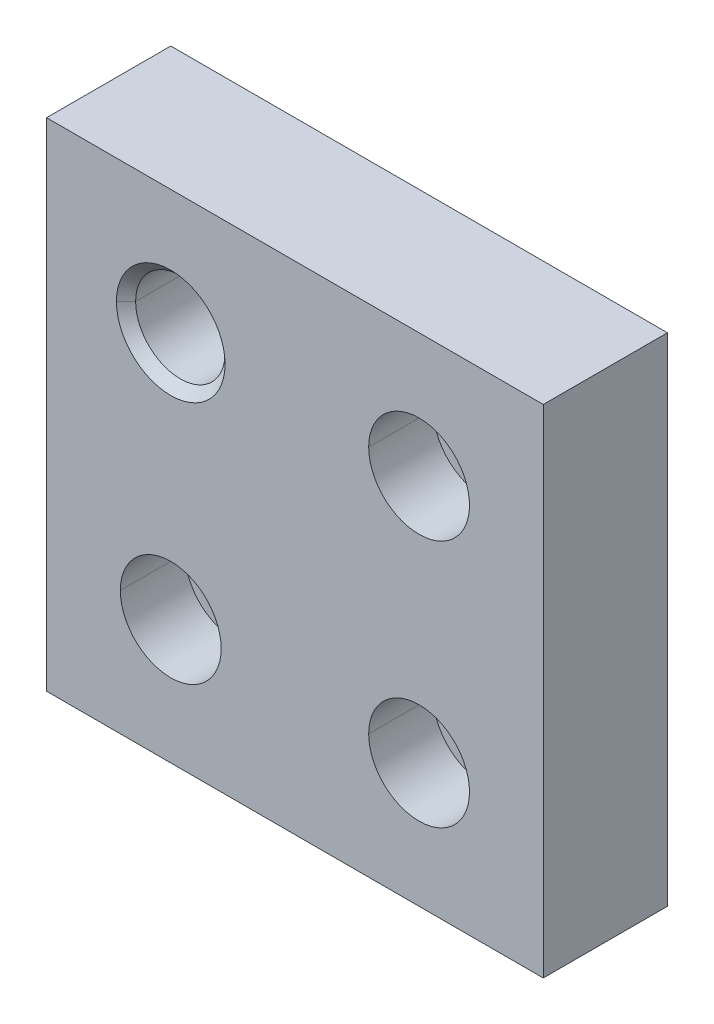
ISO-10303-21;
HEADER;
FILE_DESCRIPTION(('STEP AP214'),'2;1');
FILE_NAME('part.step','',(''),(''),'','','');
FILE_SCHEMA(('AUTOMOTIVE_DESIGN { 1 0 10303 214 1 1 1 1 }'));
ENDSEC;
DATA;
#1=APPLICATION_CONTEXT('core data for automotive mechanical design processes');
#2=APPLICATION_PROTOCOL_DEFINITION('international standard','automotive_design',2000,#1);
#3=PRODUCT_CONTEXT('',#1,'mechanical');
#4=PRODUCT('Part','Part','',(#3));
#5=PRODUCT_RELATED_PRODUCT_CATEGORY('part','',(#4));
#6=PRODUCT_DEFINITION_FORMATION('','',#4);
#7=PRODUCT_DEFINITION_CONTEXT('part definition',#1,'design');
#8=PRODUCT_DEFINITION('design','',#6,#7);
#9=PRODUCT_DEFINITION_SHAPE('','',#8);
#10=(LENGTH_UNIT() NAMED_UNIT(*) SI_UNIT(.MILLI.,.METRE.));
#11=(NAMED_UNIT(*) PLANE_ANGLE_UNIT() SI_UNIT($,.RADIAN.));
#12=(NAMED_UNIT(*) SI_UNIT($,.STERADIAN.) SOLID_ANGLE_UNIT());
#13=UNCERTAINTY_MEASURE_WITH_UNIT(LENGTH_MEASURE(1.E-05),#10,'distance_accuracy_value','');
#14=(GEOMETRIC_REPRESENTATION_CONTEXT(3) GLOBAL_UNCERTAINTY_ASSIGNED_CONTEXT((#13)) GLOBAL_UNIT_ASSIGNED_CONTEXT((#10,
#11,#12)) REPRESENTATION_CONTEXT('',''));
#15=CARTESIAN_POINT('',(0.,0.,0.));
#16=DIRECTION('',(0.,0.,1.));
#17=DIRECTION('',(1.,0.,0.));
#18=AXIS2_PLACEMENT_3D('',#15,#16,#17);
#19=CARTESIAN_POINT('',(25.4,-25.4,0.));
#20=DIRECTION('',(1.,0.,0.));
#21=DIRECTION('',(0.,0.,-1.));
#22=AXIS2_PLACEMENT_3D('',#19,#20,#21);
#23=PLANE('',#22);
#24=DIRECTION('',(0.,1.,0.));
#25=VECTOR('',#24,1.);
#26=CARTESIAN_POINT('',(25.4,-25.4,12.7));
#27=LINE('',#26,#25);
#28=CARTESIAN_POINT('',(25.4,-25.4,12.7));
#29=VERTEX_POINT('',#28);
#30=CARTESIAN_POINT('',(25.4,25.4,12.7));
#31=VERTEX_POINT('',#30);
#32=EDGE_CURVE('E11',#29,#31,#27,.T.);
#33=ORIENTED_EDGE('',*,*,#32,.F.);
#34=DIRECTION('',(0.,0.,1.));
#35=VECTOR('',#34,1.);
#36=CARTESIAN_POINT('',(25.4,-25.4,0.));
#37=LINE('',#36,#35);
#38=CARTESIAN_POINT('',(25.4,-25.4,0.));
#39=VERTEX_POINT('',#38);
#40=EDGE_CURVE('E25',#39,#29,#37,.T.);
#41=ORIENTED_EDGE('',*,*,#40,.F.);
#42=DIRECTION('',(0.,1.,0.));
#43=VECTOR('',#42,1.);
#44=CARTESIAN_POINT('',(25.4,-25.4,0.));
#45=LINE('',#44,#43);
#46=CARTESIAN_POINT('',(25.4,25.4,0.));
#47=VERTEX_POINT('',#46);
#48=EDGE_CURVE('E432',#39,#47,#45,.T.);
#49=ORIENTED_EDGE('',*,*,#48,.T.);
#50=DIRECTION('',(0.,0.,1.));
#51=VECTOR('',#50,1.);
#52=CARTESIAN_POINT('',(25.4,25.4,0.));
#53=LINE('',#52,#51);
#54=EDGE_CURVE('E428',#47,#31,#53,.T.);
#55=ORIENTED_EDGE('',*,*,#54,.T.);
#56=EDGE_LOOP('',(#33,#41,#49,#55));
#57=FACE_BOUND('',#56,.T.);
#58=ADVANCED_FACE('F17',(#57),#23,.T.);
#59=CARTESIAN_POINT('',(25.4,25.4,0.));
#60=DIRECTION('',(0.,1.,0.));
#61=DIRECTION('',(0.,0.,1.));
#62=AXIS2_PLACEMENT_3D('',#59,#60,#61);
#63=PLANE('',#62);
#64=DIRECTION('',(-1.,0.,0.));
#65=VECTOR('',#64,1.);
#66=CARTESIAN_POINT('',(25.4,25.4,12.7));
#67=LINE('',#66,#65);
#68=CARTESIAN_POINT('',(-25.4,25.4,12.7));
#69=VERTEX_POINT('',#68);
#70=EDGE_CURVE('E423',#31,#69,#67,.T.);
#71=ORIENTED_EDGE('',*,*,#70,.F.);
#72=ORIENTED_EDGE('',*,*,#54,.F.);
#73=DIRECTION('',(-1.,0.,0.));
#74=VECTOR('',#73,1.);
#75=CARTESIAN_POINT('',(25.4,25.4,0.));
#76=LINE('',#75,#74);
#77=CARTESIAN_POINT('',(-25.4,25.4,0.));
#78=VERTEX_POINT('',#77);
#79=EDGE_CURVE('E419',#47,#78,#76,.T.);
#80=ORIENTED_EDGE('',*,*,#79,.T.);
#81=DIRECTION('',(0.,0.,1.));
#82=VECTOR('',#81,1.);
#83=CARTESIAN_POINT('',(-25.4,25.4,0.));
#84=LINE('',#83,#82);
#85=EDGE_CURVE('E415',#78,#69,#84,.T.);
#86=ORIENTED_EDGE('',*,*,#85,.T.);
#87=EDGE_LOOP('',(#71,#72,#80,#86));
#88=FACE_BOUND('',#87,.T.);
#89=ADVANCED_FACE('F453',(#88),#63,.T.);
#90=CARTESIAN_POINT('',(-25.4,25.4,0.));
#91=DIRECTION('',(-1.,0.,0.));
#92=DIRECTION('',(0.,0.,1.));
#93=AXIS2_PLACEMENT_3D('',#90,#91,#92);
#94=PLANE('',#93);
#95=DIRECTION('',(0.,-1.,0.));
#96=VECTOR('',#95,1.);
#97=CARTESIAN_POINT('',(-25.4,25.4,12.7));
#98=LINE('',#97,#96);
#99=CARTESIAN_POINT('',(-25.4,-25.4,12.7));
#100=VERTEX_POINT('',#99);
#101=EDGE_CURVE('E410',#69,#100,#98,.T.);
#102=ORIENTED_EDGE('',*,*,#101,.F.);
#103=ORIENTED_EDGE('',*,*,#85,.F.);
#104=DIRECTION('',(0.,-1.,0.));
#105=VECTOR('',#104,1.);
#106=CARTESIAN_POINT('',(-25.4,25.4,0.));
#107=LINE('',#106,#105);
#108=CARTESIAN_POINT('',(-25.4,-25.4,0.));
#109=VERTEX_POINT('',#108);
#110=EDGE_CURVE('E406',#78,#109,#107,.T.);
#111=ORIENTED_EDGE('',*,*,#110,.T.);
#112=DIRECTION('',(0.,0.,1.));
#113=VECTOR('',#112,1.);
#114=CARTESIAN_POINT('',(-25.4,-25.4,0.));
#115=LINE('',#114,#113);
#116=EDGE_CURVE('E402',#109,#100,#115,.T.);
#117=ORIENTED_EDGE('',*,*,#116,.T.);
#118=EDGE_LOOP('',(#102,#103,#111,#117));
#119=FACE_BOUND('',#118,.T.);
#120=ADVANCED_FACE('F459',(#119),#94,.T.);
#121=CARTESIAN_POINT('',(-25.4,-25.4,0.));
#122=DIRECTION('',(0.,-1.,0.));
#123=DIRECTION('',(1.,0.,0.));
#124=AXIS2_PLACEMENT_3D('',#121,#122,#123);
#125=PLANE('',#124);
#126=DIRECTION('',(1.,0.,0.));
#127=VECTOR('',#126,1.);
#128=CARTESIAN_POINT('',(-25.4,-25.4,12.7));
#129=LINE('',#128,#127);
#130=EDGE_CURVE('E398',#100,#29,#129,.T.);
#131=ORIENTED_EDGE('',*,*,#130,.F.);
#132=ORIENTED_EDGE('',*,*,#116,.F.);
#133=DIRECTION('',(1.,0.,0.));
#134=VECTOR('',#133,1.);
#135=CARTESIAN_POINT('',(-25.4,-25.4,0.));
#136=LINE('',#135,#134);
#137=EDGE_CURVE('E394',#109,#39,#136,.T.);
#138=ORIENTED_EDGE('',*,*,#137,.T.);
#139=ORIENTED_EDGE('',*,*,#40,.T.);
#140=EDGE_LOOP('',(#131,#132,#138,#139));
#141=FACE_BOUND('',#140,.T.);
#142=ADVANCED_FACE('F442',(#141),#125,.T.);
#143=CARTESIAN_POINT('',(0.,0.,0.));
#144=DIRECTION('',(0.,0.,1.));
#145=DIRECTION('',(1.,0.,0.));
#146=AXIS2_PLACEMENT_3D('',#143,#144,#145);
#147=PLANE('',#146);
#148=CARTESIAN_POINT('',(-12.7,-12.7,0.));
#149=DIRECTION('',(0.,0.,1.));
#150=DIRECTION('',(1.,0.,0.));
#151=AXIS2_PLACEMENT_3D('',#148,#149,#150);
#152=CIRCLE('',#151,3.2639);
#153=CARTESIAN_POINT('',(-9.4361,-12.7,0.));
#154=VERTEX_POINT('',#153);
#155=CARTESIAN_POINT('',(-15.9639,-12.7,0.));
#156=VERTEX_POINT('',#155);
#157=EDGE_CURVE('E163',#154,#156,#152,.T.);
#158=ORIENTED_EDGE('',*,*,#157,.T.);
#159=CARTESIAN_POINT('',(-12.7,-12.7,0.));
#160=DIRECTION('',(0.,0.,1.));
#161=DIRECTION('',(1.,0.,0.));
#162=AXIS2_PLACEMENT_3D('',#159,#160,#161);
#163=CIRCLE('',#162,3.2639);
#164=EDGE_CURVE('E387',#156,#154,#163,.T.);
#165=ORIENTED_EDGE('',*,*,#164,.T.);
#166=EDGE_LOOP('',(#158,#165));
#167=FACE_BOUND('',#166,.T.);
#168=CARTESIAN_POINT('',(12.7,-12.7,0.));
#169=DIRECTION('',(0.,0.,1.));
#170=DIRECTION('',(1.,0.,0.));
#171=AXIS2_PLACEMENT_3D('',#168,#169,#170);
#172=CIRCLE('',#171,3.2639);
#173=CARTESIAN_POINT('',(15.9639,-12.7,0.));
#174=VERTEX_POINT('',#173);
#175=CARTESIAN_POINT('',(9.4361,-12.7,0.));
#176=VERTEX_POINT('',#175);
#177=EDGE_CURVE('E383',#174,#176,#172,.T.);
#178=ORIENTED_EDGE('',*,*,#177,.T.);
#179=CARTESIAN_POINT('',(12.7,-12.7,0.));
#180=DIRECTION('',(0.,0.,1.));
#181=DIRECTION('',(1.,0.,0.));
#182=AXIS2_PLACEMENT_3D('',#179,#180,#181);
#183=CIRCLE('',#182,3.2639);
#184=EDGE_CURVE('E379',#176,#174,#183,.T.);
#185=ORIENTED_EDGE('',*,*,#184,.T.);
#186=EDGE_LOOP('',(#178,#185));
#187=FACE_BOUND('',#186,.T.);
#188=CARTESIAN_POINT('',(12.7,12.7,0.));
#189=DIRECTION('',(0.,0.,1.));
#190=DIRECTION('',(1.,0.,0.));
#191=AXIS2_PLACEMENT_3D('',#188,#189,#190);
#192=CIRCLE('',#191,3.2639);
#193=CARTESIAN_POINT('',(15.9639,12.7,0.));
#194=VERTEX_POINT('',#193);
#195=CARTESIAN_POINT('',(9.4361,12.7,0.));
#196=VERTEX_POINT('',#195);
#197=EDGE_CURVE('E375',#194,#196,#192,.T.);
#198=ORIENTED_EDGE('',*,*,#197,.T.);
#199=CARTESIAN_POINT('',(12.7,12.7,0.));
#200=DIRECTION('',(0.,0.,1.));
#201=DIRECTION('',(1.,0.,0.));
#202=AXIS2_PLACEMENT_3D('',#199,#200,#201);
#203=CIRCLE('',#202,3.2639);
#204=EDGE_CURVE('E371',#196,#194,#203,.T.);
#205=ORIENTED_EDGE('',*,*,#204,.T.);
#206=EDGE_LOOP('',(#198,#205));
#207=FACE_BOUND('',#206,.T.);
#208=CARTESIAN_POINT('',(-12.7,12.7,0.));
#209=DIRECTION('',(0.,0.,-1.));
#210=DIRECTION('',(-1.,0.,0.));
#211=AXIS2_PLACEMENT_3D('',#208,#209,#210);
#212=CIRCLE('',#211,5.55625);
#213=CARTESIAN_POINT('',(-7.14375,12.7,0.));
#214=VERTEX_POINT('',#213);
#215=CARTESIAN_POINT('',(-18.25625,12.7,0.));
#216=VERTEX_POINT('',#215);
#217=EDGE_CURVE('E366',#214,#216,#212,.T.);
#218=ORIENTED_EDGE('',*,*,#217,.F.);
#219=CARTESIAN_POINT('',(-12.7,12.7,0.));
#220=DIRECTION('',(0.,0.,-1.));
#221=DIRECTION('',(-1.,0.,0.));
#222=AXIS2_PLACEMENT_3D('',#219,#220,#221);
#223=CIRCLE('',#222,5.55625);
#224=EDGE_CURVE('E361',#216,#214,#223,.T.);
#225=ORIENTED_EDGE('',*,*,#224,.F.);
#226=EDGE_LOOP('',(#218,#225));
#227=FACE_BOUND('',#226,.T.);
#228=ORIENTED_EDGE('',*,*,#48,.F.);
#229=ORIENTED_EDGE('',*,*,#137,.F.);
#230=ORIENTED_EDGE('',*,*,#110,.F.);
#231=ORIENTED_EDGE('',*,*,#79,.F.);
#232=EDGE_LOOP('',(#228,#229,#230,#231));
#233=FACE_BOUND('',#232,.T.);
#234=ADVANCED_FACE('F449',(#167,#187,#207,#227,#233),#147,.F.);
#235=CARTESIAN_POINT('',(-12.7,12.7,0.98171));
#236=DIRECTION('',(0.,0.,-1.));
#237=DIRECTION('',(0.,-1.,0.));
#238=AXIS2_PLACEMENT_3D('',#235,#236,#237);
#239=CONICAL_SURFACE('',#238,4.57454,0.785398163397446);
#240=DIRECTION('',(0.707106781186546,0.,-0.707106781186549));
#241=VECTOR('',#240,1.);
#242=CARTESIAN_POINT('',(-8.12546,12.7,0.981710000000001));
#243=LINE('',#242,#241);
#244=CARTESIAN_POINT('',(-8.12546,12.7,0.98171));
#245=VERTEX_POINT('',#244);
#246=EDGE_CURVE('E356',#245,#214,#243,.T.);
#247=ORIENTED_EDGE('',*,*,#246,.F.);
#248=CARTESIAN_POINT('',(-12.7,12.7,0.98171));
#249=DIRECTION('',(0.,0.,-1.));
#250=DIRECTION('',(-1.,0.,0.));
#251=AXIS2_PLACEMENT_3D('',#248,#249,#250);
#252=CIRCLE('',#251,4.57454);
#253=CARTESIAN_POINT('',(-17.27454,12.7,0.98171));
#254=VERTEX_POINT('',#253);
#255=EDGE_CURVE('E351',#254,#245,#252,.T.);
#256=ORIENTED_EDGE('',*,*,#255,.F.);
#257=DIRECTION('',(-0.707106781186546,0.,-0.707106781186549));
#258=VECTOR('',#257,1.);
#259=CARTESIAN_POINT('',(-17.27454,12.7,0.981710000000001));
#260=LINE('',#259,#258);
#261=EDGE_CURVE('E346',#254,#216,#260,.T.);
#262=ORIENTED_EDGE('',*,*,#261,.T.);
#263=ORIENTED_EDGE('',*,*,#224,.T.);
#264=EDGE_LOOP('',(#247,#256,#262,#263));
#265=FACE_BOUND('',#264,.T.);
#266=ADVANCED_FACE('F502',(#265),#239,.F.);
#267=CARTESIAN_POINT('',(-12.7,12.7,0.98171));
#268=DIRECTION('',(0.,0.,-1.));
#269=DIRECTION('',(0.,1.,0.));
#270=AXIS2_PLACEMENT_3D('',#267,#268,#269);
#271=CONICAL_SURFACE('',#270,4.57454,0.785398163397446);
#272=ORIENTED_EDGE('',*,*,#246,.T.);
#273=ORIENTED_EDGE('',*,*,#217,.T.);
#274=ORIENTED_EDGE('',*,*,#261,.F.);
#275=CARTESIAN_POINT('',(-12.7,12.7,0.98171));
#276=DIRECTION('',(0.,0.,-1.));
#277=DIRECTION('',(-1.,0.,0.));
#278=AXIS2_PLACEMENT_3D('',#275,#276,#277);
#279=CIRCLE('',#278,4.57454);
#280=EDGE_CURVE('E341',#245,#254,#279,.T.);
#281=ORIENTED_EDGE('',*,*,#280,.F.);
#282=EDGE_LOOP('',(#272,#273,#274,#281));
#283=FACE_BOUND('',#282,.T.);
#284=ADVANCED_FACE('F513',(#283),#271,.F.);
#285=CARTESIAN_POINT('',(-12.7,12.7,0.));
#286=DIRECTION('',(0.,0.,-1.));
#287=DIRECTION('',(0.,1.,0.));
#288=AXIS2_PLACEMENT_3D('',#285,#286,#287);
#289=CYLINDRICAL_SURFACE('',#288,4.57454);
#290=DIRECTION('',(0.,0.,-1.));
#291=VECTOR('',#290,1.);
#292=CARTESIAN_POINT('',(-8.12546,12.7,11.71829));
#293=LINE('',#292,#291);
#294=CARTESIAN_POINT('',(-8.12546,12.7,11.71829));
#295=VERTEX_POINT('',#294);
#296=EDGE_CURVE('E336',#295,#245,#293,.T.);
#297=ORIENTED_EDGE('',*,*,#296,.T.);
#298=ORIENTED_EDGE('',*,*,#280,.T.);
#299=DIRECTION('',(0.,0.,-1.));
#300=VECTOR('',#299,1.);
#301=CARTESIAN_POINT('',(-17.27454,12.7,11.71829));
#302=LINE('',#301,#300);
#303=CARTESIAN_POINT('',(-17.27454,12.7,11.71829));
#304=VERTEX_POINT('',#303);
#305=EDGE_CURVE('E331',#304,#254,#302,.T.);
#306=ORIENTED_EDGE('',*,*,#305,.F.);
#307=CARTESIAN_POINT('',(-12.7,12.7,11.71829));
#308=DIRECTION('',(0.,0.,-1.));
#309=DIRECTION('',(-1.,0.,0.));
#310=AXIS2_PLACEMENT_3D('',#307,#308,#309);
#311=CIRCLE('',#310,4.57454);
#312=EDGE_CURVE('E326',#295,#304,#311,.T.);
#313=ORIENTED_EDGE('',*,*,#312,.F.);
#314=EDGE_LOOP('',(#297,#298,#306,#313));
#315=FACE_BOUND('',#314,.T.);
#316=ADVANCED_FACE('F524',(#315),#289,.F.);
#317=CARTESIAN_POINT('',(-12.7,12.7,12.7));
#318=DIRECTION('',(0.,0.,1.));
#319=DIRECTION('',(0.,1.,0.));
#320=AXIS2_PLACEMENT_3D('',#317,#318,#319);
#321=CONICAL_SURFACE('',#320,5.55625,0.785398163397446);
#322=DIRECTION('',(-0.707106781186546,0.,0.707106781186549));
#323=VECTOR('',#322,1.);
#324=CARTESIAN_POINT('',(-17.27454,12.7,11.71829));
#325=LINE('',#324,#323);
#326=CARTESIAN_POINT('',(-18.25625,12.7,12.7));
#327=VERTEX_POINT('',#326);
#328=EDGE_CURVE('E322',#304,#327,#325,.T.);
#329=ORIENTED_EDGE('',*,*,#328,.T.);
#330=CARTESIAN_POINT('',(-12.7,12.7,12.7));
#331=DIRECTION('',(0.,0.,-1.));
#332=DIRECTION('',(-1.,0.,0.));
#333=AXIS2_PLACEMENT_3D('',#330,#331,#332);
#334=CIRCLE('',#333,5.55625);
#335=CARTESIAN_POINT('',(-7.14375,12.7,12.7));
#336=VERTEX_POINT('',#335);
#337=EDGE_CURVE('E317',#336,#327,#334,.T.);
#338=ORIENTED_EDGE('',*,*,#337,.F.);
#339=DIRECTION('',(0.707106781186545,0.,0.70710678118655));
#340=VECTOR('',#339,1.);
#341=CARTESIAN_POINT('',(-8.12546,12.7,11.71829));
#342=LINE('',#341,#340);
#343=EDGE_CURVE('E312',#295,#336,#342,.T.);
#344=ORIENTED_EDGE('',*,*,#343,.F.);
#345=ORIENTED_EDGE('',*,*,#312,.T.);
#346=EDGE_LOOP('',(#329,#338,#344,#345));
#347=FACE_BOUND('',#346,.T.);
#348=ADVANCED_FACE('F535',(#347),#321,.F.);
#349=CARTESIAN_POINT('',(-12.7,12.7,12.7));
#350=DIRECTION('',(0.,0.,1.));
#351=DIRECTION('',(0.,-1.,0.));
#352=AXIS2_PLACEMENT_3D('',#349,#350,#351);
#353=CONICAL_SURFACE('',#352,5.55625,0.785398163397446);
#354=ORIENTED_EDGE('',*,*,#328,.F.);
#355=CARTESIAN_POINT('',(-12.7,12.7,11.71829));
#356=DIRECTION('',(0.,0.,-1.));
#357=DIRECTION('',(-1.,0.,0.));
#358=AXIS2_PLACEMENT_3D('',#355,#356,#357);
#359=CIRCLE('',#358,4.57454);
#360=EDGE_CURVE('E307',#304,#295,#359,.T.);
#361=ORIENTED_EDGE('',*,*,#360,.T.);
#362=ORIENTED_EDGE('',*,*,#343,.T.);
#363=CARTESIAN_POINT('',(-12.7,12.7,12.7));
#364=DIRECTION('',(0.,0.,-1.));
#365=DIRECTION('',(-1.,0.,0.));
#366=AXIS2_PLACEMENT_3D('',#363,#364,#365);
#367=CIRCLE('',#366,5.55625);
#368=EDGE_CURVE('E302',#327,#336,#367,.T.);
#369=ORIENTED_EDGE('',*,*,#368,.F.);
#370=EDGE_LOOP('',(#354,#361,#362,#369));
#371=FACE_BOUND('',#370,.T.);
#372=ADVANCED_FACE('F546',(#371),#353,.F.);
#373=CARTESIAN_POINT('',(0.,0.,12.7));
#374=DIRECTION('',(0.,0.,1.));
#375=DIRECTION('',(1.,0.,0.));
#376=AXIS2_PLACEMENT_3D('',#373,#374,#375);
#377=PLANE('',#376);
#378=CARTESIAN_POINT('',(-12.7,-12.7,12.7));
#379=DIRECTION('',(0.,0.,1.));
#380=DIRECTION('',(1.,0.,0.));
#381=AXIS2_PLACEMENT_3D('',#378,#379,#380);
#382=CIRCLE('',#381,5.1562);
#383=CARTESIAN_POINT('',(-17.8562,-12.7,12.7));
#384=VERTEX_POINT('',#383);
#385=CARTESIAN_POINT('',(-7.5438,-12.7,12.7));
#386=VERTEX_POINT('',#385);
#387=EDGE_CURVE('E297',#384,#386,#382,.T.);
#388=ORIENTED_EDGE('',*,*,#387,.F.);
#389=CARTESIAN_POINT('',(-12.7,-12.7,12.7));
#390=DIRECTION('',(0.,0.,1.));
#391=DIRECTION('',(1.,0.,0.));
#392=AXIS2_PLACEMENT_3D('',#389,#390,#391);
#393=CIRCLE('',#392,5.1562);
#394=EDGE_CURVE('E292',#386,#384,#393,.T.);
#395=ORIENTED_EDGE('',*,*,#394,.F.);
#396=EDGE_LOOP('',(#388,#395));
#397=FACE_BOUND('',#396,.T.);
#398=CARTESIAN_POINT('',(12.7,-12.7,12.7));
#399=DIRECTION('',(0.,0.,1.));
#400=DIRECTION('',(1.,0.,0.));
#401=AXIS2_PLACEMENT_3D('',#398,#399,#400);
#402=CIRCLE('',#401,5.1562);
#403=CARTESIAN_POINT('',(7.5438,-12.7,12.7));
#404=VERTEX_POINT('',#403);
#405=CARTESIAN_POINT('',(17.8562,-12.7,12.7));
#406=VERTEX_POINT('',#405);
#407=EDGE_CURVE('E287',#404,#406,#402,.T.);
#408=ORIENTED_EDGE('',*,*,#407,.F.);
#409=CARTESIAN_POINT('',(12.7,-12.7,12.7));
#410=DIRECTION('',(0.,0.,1.));
#411=DIRECTION('',(1.,0.,0.));
#412=AXIS2_PLACEMENT_3D('',#409,#410,#411);
#413=CIRCLE('',#412,5.1562);
#414=EDGE_CURVE('E282',#406,#404,#413,.T.);
#415=ORIENTED_EDGE('',*,*,#414,.F.);
#416=EDGE_LOOP('',(#408,#415));
#417=FACE_BOUND('',#416,.T.);
#418=CARTESIAN_POINT('',(12.7,12.7,12.7));
#419=DIRECTION('',(0.,0.,1.));
#420=DIRECTION('',(1.,0.,0.));
#421=AXIS2_PLACEMENT_3D('',#418,#419,#420);
#422=CIRCLE('',#421,5.1562);
#423=CARTESIAN_POINT('',(7.5438,12.7,12.7));
#424=VERTEX_POINT('',#423);
#425=CARTESIAN_POINT('',(17.8562,12.7,12.7));
#426=VERTEX_POINT('',#425);
#427=EDGE_CURVE('E277',#424,#426,#422,.T.);
#428=ORIENTED_EDGE('',*,*,#427,.F.);
#429=CARTESIAN_POINT('',(12.7,12.7,12.7));
#430=DIRECTION('',(0.,0.,1.));
#431=DIRECTION('',(1.,0.,0.));
#432=AXIS2_PLACEMENT_3D('',#429,#430,#431);
#433=CIRCLE('',#432,5.1562);
#434=EDGE_CURVE('E272',#426,#424,#433,.T.);
#435=ORIENTED_EDGE('',*,*,#434,.F.);
#436=EDGE_LOOP('',(#428,#435));
#437=FACE_BOUND('',#436,.T.);
#438=ORIENTED_EDGE('',*,*,#368,.T.);
#439=ORIENTED_EDGE('',*,*,#337,.T.);
#440=EDGE_LOOP('',(#438,#439));
#441=FACE_BOUND('',#440,.T.);
#442=ORIENTED_EDGE('',*,*,#32,.T.);
#443=ORIENTED_EDGE('',*,*,#70,.T.);
#444=ORIENTED_EDGE('',*,*,#101,.T.);
#445=ORIENTED_EDGE('',*,*,#130,.T.);
#446=EDGE_LOOP('',(#442,#443,#444,#445));
#447=FACE_BOUND('',#446,.T.);
#448=ADVANCED_FACE('F457',(#397,#417,#437,#441,#447),#377,.T.);
#449=CARTESIAN_POINT('',(12.7,12.7,12.7));
#450=DIRECTION('',(0.,0.,1.));
#451=DIRECTION('',(0.,-1.,0.));
#452=AXIS2_PLACEMENT_3D('',#449,#450,#451);
#453=CYLINDRICAL_SURFACE('',#452,5.1562);
#454=DIRECTION('',(0.,0.,1.));
#455=VECTOR('',#454,1.);
#456=CARTESIAN_POINT('',(7.5438,12.7,6.096));
#457=LINE('',#456,#455);
#458=CARTESIAN_POINT('',(7.5438,12.7,6.096));
#459=VERTEX_POINT('',#458);
#460=EDGE_CURVE('E267',#459,#424,#457,.T.);
#461=ORIENTED_EDGE('',*,*,#460,.F.);
#462=CARTESIAN_POINT('',(12.7,12.7,6.096));
#463=DIRECTION('',(0.,0.,1.));
#464=DIRECTION('',(1.,0.,0.));
#465=AXIS2_PLACEMENT_3D('',#462,#463,#464);
#466=CIRCLE('',#465,5.1562);
#467=CARTESIAN_POINT('',(17.8562,12.7,6.096));
#468=VERTEX_POINT('',#467);
#469=EDGE_CURVE('E262',#468,#459,#466,.T.);
#470=ORIENTED_EDGE('',*,*,#469,.F.);
#471=DIRECTION('',(0.,0.,1.));
#472=VECTOR('',#471,1.);
#473=CARTESIAN_POINT('',(17.8562,12.7,6.096));
#474=LINE('',#473,#472);
#475=EDGE_CURVE('E257',#468,#426,#474,.T.);
#476=ORIENTED_EDGE('',*,*,#475,.T.);
#477=ORIENTED_EDGE('',*,*,#434,.T.);
#478=EDGE_LOOP('',(#461,#470,#476,#477));
#479=FACE_BOUND('',#478,.T.);
#480=ADVANCED_FACE('F567',(#479),#453,.F.);
#481=CARTESIAN_POINT('',(12.7,12.7,12.7));
#482=DIRECTION('',(0.,0.,1.));
#483=DIRECTION('',(0.,1.,0.));
#484=AXIS2_PLACEMENT_3D('',#481,#482,#483);
#485=CYLINDRICAL_SURFACE('',#484,5.1562);
#486=ORIENTED_EDGE('',*,*,#460,.T.);
#487=ORIENTED_EDGE('',*,*,#427,.T.);
#488=ORIENTED_EDGE('',*,*,#475,.F.);
#489=CARTESIAN_POINT('',(12.7,12.7,6.096));
#490=DIRECTION('',(0.,0.,1.));
#491=DIRECTION('',(1.,0.,0.));
#492=AXIS2_PLACEMENT_3D('',#489,#490,#491);
#493=CIRCLE('',#492,5.1562);
#494=EDGE_CURVE('E252',#459,#468,#493,.T.);
#495=ORIENTED_EDGE('',*,*,#494,.F.);
#496=EDGE_LOOP('',(#486,#487,#488,#495));
#497=FACE_BOUND('',#496,.T.);
#498=ADVANCED_FACE('F578',(#497),#485,.F.);
#499=CARTESIAN_POINT('',(15.9639,12.7,6.096));
#500=DIRECTION('',(0.,0.,1.));
#501=DIRECTION('',(1.,0.,0.));
#502=AXIS2_PLACEMENT_3D('',#499,#500,#501);
#503=PLANE('',#502);
#504=ORIENTED_EDGE('',*,*,#469,.T.);
#505=ORIENTED_EDGE('',*,*,#494,.T.);
#506=EDGE_LOOP('',(#504,#505));
#507=FACE_BOUND('',#506,.T.);
#508=CARTESIAN_POINT('',(12.7,12.7,6.096));
#509=DIRECTION('',(0.,0.,1.));
#510=DIRECTION('',(1.,0.,0.));
#511=AXIS2_PLACEMENT_3D('',#508,#509,#510);
#512=CIRCLE('',#511,3.2639);
#513=CARTESIAN_POINT('',(9.4361,12.7,6.096));
#514=VERTEX_POINT('',#513);
#515=CARTESIAN_POINT('',(15.9639,12.7,6.096));
#516=VERTEX_POINT('',#515);
#517=EDGE_CURVE('E247',#514,#516,#512,.T.);
#518=ORIENTED_EDGE('',*,*,#517,.F.);
#519=CARTESIAN_POINT('',(12.7,12.7,6.096));
#520=DIRECTION('',(0.,0.,1.));
#521=DIRECTION('',(1.,0.,0.));
#522=AXIS2_PLACEMENT_3D('',#519,#520,#521);
#523=CIRCLE('',#522,3.2639);
#524=EDGE_CURVE('E242',#516,#514,#523,.T.);
#525=ORIENTED_EDGE('',*,*,#524,.F.);
#526=EDGE_LOOP('',(#518,#525));
#527=FACE_BOUND('',#526,.T.);
#528=ADVANCED_FACE('F589',(#507,#527),#503,.T.);
#529=CARTESIAN_POINT('',(12.7,12.7,12.7));
#530=DIRECTION('',(0.,0.,1.));
#531=DIRECTION('',(0.,-1.,0.));
#532=AXIS2_PLACEMENT_3D('',#529,#530,#531);
#533=CYLINDRICAL_SURFACE('',#532,3.2639);
#534=DIRECTION('',(0.,0.,1.));
#535=VECTOR('',#534,1.);
#536=CARTESIAN_POINT('',(9.4361,12.7,0.));
#537=LINE('',#536,#535);
#538=EDGE_CURVE('E237',#196,#514,#537,.T.);
#539=ORIENTED_EDGE('',*,*,#538,.F.);
#540=ORIENTED_EDGE('',*,*,#197,.F.);
#541=DIRECTION('',(0.,0.,1.));
#542=VECTOR('',#541,1.);
#543=CARTESIAN_POINT('',(15.9639,12.7,0.));
#544=LINE('',#543,#542);
#545=EDGE_CURVE('E232',#194,#516,#544,.T.);
#546=ORIENTED_EDGE('',*,*,#545,.T.);
#547=ORIENTED_EDGE('',*,*,#524,.T.);
#548=EDGE_LOOP('',(#539,#540,#546,#547));
#549=FACE_BOUND('',#548,.T.);
#550=ADVANCED_FACE('F600',(#549),#533,.F.);
#551=CARTESIAN_POINT('',(12.7,12.7,12.7));
#552=DIRECTION('',(0.,0.,1.));
#553=DIRECTION('',(0.,1.,0.));
#554=AXIS2_PLACEMENT_3D('',#551,#552,#553);
#555=CYLINDRICAL_SURFACE('',#554,3.2639);
#556=ORIENTED_EDGE('',*,*,#538,.T.);
#557=ORIENTED_EDGE('',*,*,#517,.T.);
#558=ORIENTED_EDGE('',*,*,#545,.F.);
#559=ORIENTED_EDGE('',*,*,#204,.F.);
#560=EDGE_LOOP('',(#556,#557,#558,#559));
#561=FACE_BOUND('',#560,.T.);
#562=ADVANCED_FACE('F611',(#561),#555,.F.);
#563=CARTESIAN_POINT('',(12.7,-12.7,12.7));
#564=DIRECTION('',(0.,0.,1.));
#565=DIRECTION('',(0.,-1.,0.));
#566=AXIS2_PLACEMENT_3D('',#563,#564,#565);
#567=CYLINDRICAL_SURFACE('',#566,5.1562);
#568=DIRECTION('',(0.,0.,1.));
#569=VECTOR('',#568,1.);
#570=CARTESIAN_POINT('',(7.5438,-12.7,6.096));
#571=LINE('',#570,#569);
#572=CARTESIAN_POINT('',(7.5438,-12.7,6.096));
#573=VERTEX_POINT('',#572);
#574=EDGE_CURVE('E227',#573,#404,#571,.T.);
#575=ORIENTED_EDGE('',*,*,#574,.F.);
#576=CARTESIAN_POINT('',(12.7,-12.7,6.096));
#577=DIRECTION('',(0.,0.,1.));
#578=DIRECTION('',(1.,0.,0.));
#579=AXIS2_PLACEMENT_3D('',#576,#577,#578);
#580=CIRCLE('',#579,5.1562);
#581=CARTESIAN_POINT('',(17.8562,-12.7,6.096));
#582=VERTEX_POINT('',#581);
#583=EDGE_CURVE('E222',#582,#573,#580,.T.);
#584=ORIENTED_EDGE('',*,*,#583,.F.);
#585=DIRECTION('',(0.,0.,1.));
#586=VECTOR('',#585,1.);
#587=CARTESIAN_POINT('',(17.8562,-12.7,6.096));
#588=LINE('',#587,#586);
#589=EDGE_CURVE('E217',#582,#406,#588,.T.);
#590=ORIENTED_EDGE('',*,*,#589,.T.);
#591=ORIENTED_EDGE('',*,*,#414,.T.);
#592=EDGE_LOOP('',(#575,#584,#590,#591));
#593=FACE_BOUND('',#592,.T.);
#594=ADVANCED_FACE('F622',(#593),#567,.F.);
#595=CARTESIAN_POINT('',(12.7,-12.7,12.7));
#596=DIRECTION('',(0.,0.,1.));
#597=DIRECTION('',(0.,1.,0.));
#598=AXIS2_PLACEMENT_3D('',#595,#596,#597);
#599=CYLINDRICAL_SURFACE('',#598,5.1562);
#600=ORIENTED_EDGE('',*,*,#574,.T.);
#601=ORIENTED_EDGE('',*,*,#407,.T.);
#602=ORIENTED_EDGE('',*,*,#589,.F.);
#603=CARTESIAN_POINT('',(12.7,-12.7,6.096));
#604=DIRECTION('',(0.,0.,1.));
#605=DIRECTION('',(1.,0.,0.));
#606=AXIS2_PLACEMENT_3D('',#603,#604,#605);
#607=CIRCLE('',#606,5.1562);
#608=EDGE_CURVE('E212',#573,#582,#607,.T.);
#609=ORIENTED_EDGE('',*,*,#608,.F.);
#610=EDGE_LOOP('',(#600,#601,#602,#609));
#611=FACE_BOUND('',#610,.T.);
#612=ADVANCED_FACE('F633',(#611),#599,.F.);
#613=CARTESIAN_POINT('',(15.9639,-12.7,6.096));
#614=DIRECTION('',(0.,0.,1.));
#615=DIRECTION('',(1.,0.,0.));
#616=AXIS2_PLACEMENT_3D('',#613,#614,#615);
#617=PLANE('',#616);
#618=ORIENTED_EDGE('',*,*,#583,.T.);
#619=ORIENTED_EDGE('',*,*,#608,.T.);
#620=EDGE_LOOP('',(#618,#619));
#621=FACE_BOUND('',#620,.T.);
#622=CARTESIAN_POINT('',(12.7,-12.7,6.096));
#623=DIRECTION('',(0.,0.,1.));
#624=DIRECTION('',(1.,0.,0.));
#625=AXIS2_PLACEMENT_3D('',#622,#623,#624);
#626=CIRCLE('',#625,3.2639);
#627=CARTESIAN_POINT('',(9.4361,-12.7,6.096));
#628=VERTEX_POINT('',#627);
#629=CARTESIAN_POINT('',(15.9639,-12.7,6.096));
#630=VERTEX_POINT('',#629);
#631=EDGE_CURVE('E207',#628,#630,#626,.T.);
#632=ORIENTED_EDGE('',*,*,#631,.F.);
#633=CARTESIAN_POINT('',(12.7,-12.7,6.096));
#634=DIRECTION('',(0.,0.,1.));
#635=DIRECTION('',(1.,0.,0.));
#636=AXIS2_PLACEMENT_3D('',#633,#634,#635);
#637=CIRCLE('',#636,3.2639);
#638=EDGE_CURVE('E202',#630,#628,#637,.T.);
#639=ORIENTED_EDGE('',*,*,#638,.F.);
#640=EDGE_LOOP('',(#632,#639));
#641=FACE_BOUND('',#640,.T.);
#642=ADVANCED_FACE('F644',(#621,#641),#617,.T.);
#643=CARTESIAN_POINT('',(12.7,-12.7,12.7));
#644=DIRECTION('',(0.,0.,1.));
#645=DIRECTION('',(0.,-1.,0.));
#646=AXIS2_PLACEMENT_3D('',#643,#644,#645);
#647=CYLINDRICAL_SURFACE('',#646,3.2639);
#648=DIRECTION('',(0.,0.,1.));
#649=VECTOR('',#648,1.);
#650=CARTESIAN_POINT('',(9.4361,-12.7,0.));
#651=LINE('',#650,#649);
#652=EDGE_CURVE('E197',#176,#628,#651,.T.);
#653=ORIENTED_EDGE('',*,*,#652,.F.);
#654=ORIENTED_EDGE('',*,*,#177,.F.);
#655=DIRECTION('',(0.,0.,1.));
#656=VECTOR('',#655,1.);
#657=CARTESIAN_POINT('',(15.9639,-12.7,0.));
#658=LINE('',#657,#656);
#659=EDGE_CURVE('E192',#174,#630,#658,.T.);
#660=ORIENTED_EDGE('',*,*,#659,.T.);
#661=ORIENTED_EDGE('',*,*,#638,.T.);
#662=EDGE_LOOP('',(#653,#654,#660,#661));
#663=FACE_BOUND('',#662,.T.);
#664=ADVANCED_FACE('F655',(#663),#647,.F.);
#665=CARTESIAN_POINT('',(12.7,-12.7,12.7));
#666=DIRECTION('',(0.,0.,1.));
#667=DIRECTION('',(0.,1.,0.));
#668=AXIS2_PLACEMENT_3D('',#665,#666,#667);
#669=CYLINDRICAL_SURFACE('',#668,3.2639);
#670=ORIENTED_EDGE('',*,*,#652,.T.);
#671=ORIENTED_EDGE('',*,*,#631,.T.);
#672=ORIENTED_EDGE('',*,*,#659,.F.);
#673=ORIENTED_EDGE('',*,*,#184,.F.);
#674=EDGE_LOOP('',(#670,#671,#672,#673));
#675=FACE_BOUND('',#674,.T.);
#676=ADVANCED_FACE('F666',(#675),#669,.F.);
#677=CARTESIAN_POINT('',(-12.7,-12.7,12.7));
#678=DIRECTION('',(0.,0.,1.));
#679=DIRECTION('',(0.,-1.,0.));
#680=AXIS2_PLACEMENT_3D('',#677,#678,#679);
#681=CYLINDRICAL_SURFACE('',#680,5.1562);
#682=DIRECTION('',(0.,0.,1.));
#683=VECTOR('',#682,1.);
#684=CARTESIAN_POINT('',(-17.8562,-12.7,6.096));
#685=LINE('',#684,#683);
#686=CARTESIAN_POINT('',(-17.8562,-12.7,6.096));
#687=VERTEX_POINT('',#686);
#688=EDGE_CURVE('E187',#687,#384,#685,.T.);
#689=ORIENTED_EDGE('',*,*,#688,.F.);
#690=CARTESIAN_POINT('',(-12.7,-12.7,6.096));
#691=DIRECTION('',(0.,0.,1.));
#692=DIRECTION('',(1.,0.,0.));
#693=AXIS2_PLACEMENT_3D('',#690,#691,#692);
#694=CIRCLE('',#693,5.1562);
#695=CARTESIAN_POINT('',(-7.5438,-12.7,6.096));
#696=VERTEX_POINT('',#695);
#697=EDGE_CURVE('E182',#696,#687,#694,.T.);
#698=ORIENTED_EDGE('',*,*,#697,.F.);
#699=DIRECTION('',(0.,0.,1.));
#700=VECTOR('',#699,1.);
#701=CARTESIAN_POINT('',(-7.5438,-12.7,6.096));
#702=LINE('',#701,#700);
#703=EDGE_CURVE('E171',#696,#386,#702,.T.);
#704=ORIENTED_EDGE('',*,*,#703,.T.);
#705=ORIENTED_EDGE('',*,*,#394,.T.);
#706=EDGE_LOOP('',(#689,#698,#704,#705));
#707=FACE_BOUND('',#706,.T.);
#708=ADVANCED_FACE('F677',(#707),#681,.F.);
#709=CARTESIAN_POINT('',(-12.7,-12.7,12.7));
#710=DIRECTION('',(0.,0.,1.));
#711=DIRECTION('',(0.,1.,0.));
#712=AXIS2_PLACEMENT_3D('',#709,#710,#711);
#713=CYLINDRICAL_SURFACE('',#712,5.1562);
#714=ORIENTED_EDGE('',*,*,#688,.T.);
#715=ORIENTED_EDGE('',*,*,#387,.T.);
#716=ORIENTED_EDGE('',*,*,#703,.F.);
#717=CARTESIAN_POINT('',(-12.7,-12.7,6.096));
#718=DIRECTION('',(0.,0.,1.));
#719=DIRECTION('',(1.,0.,0.));
#720=AXIS2_PLACEMENT_3D('',#717,#718,#719);
#721=CIRCLE('',#720,5.1562);
#722=EDGE_CURVE('E168',#687,#696,#721,.T.);
#723=ORIENTED_EDGE('',*,*,#722,.F.);
#724=EDGE_LOOP('',(#714,#715,#716,#723));
#725=FACE_BOUND('',#724,.T.);
#726=ADVANCED_FACE('F688',(#725),#713,.F.);
#727=CARTESIAN_POINT('',(-9.4361,-12.7,6.096));
#728=DIRECTION('',(0.,0.,1.));
#729=DIRECTION('',(1.,0.,0.));
#730=AXIS2_PLACEMENT_3D('',#727,#728,#729);
#731=PLANE('',#730);
#732=ORIENTED_EDGE('',*,*,#697,.T.);
#733=ORIENTED_EDGE('',*,*,#722,.T.);
#734=EDGE_LOOP('',(#732,#733));
#735=FACE_BOUND('',#734,.T.);
#736=CARTESIAN_POINT('',(-12.7,-12.7,6.096));
#737=DIRECTION('',(0.,0.,1.));
#738=DIRECTION('',(1.,0.,0.));
#739=AXIS2_PLACEMENT_3D('',#736,#737,#738);
#740=CIRCLE('',#739,3.2639);
#741=CARTESIAN_POINT('',(-15.9639,-12.7,6.096));
#742=VERTEX_POINT('',#741);
#743=CARTESIAN_POINT('',(-9.4361,-12.7,6.096));
#744=VERTEX_POINT('',#743);
#745=EDGE_CURVE('E153',#742,#744,#740,.T.);
#746=ORIENTED_EDGE('',*,*,#745,.F.);
#747=CARTESIAN_POINT('',(-12.7,-12.7,6.096));
#748=DIRECTION('',(0.,0.,1.));
#749=DIRECTION('',(1.,0.,0.));
#750=AXIS2_PLACEMENT_3D('',#747,#748,#749);
#751=CIRCLE('',#750,3.2639);
#752=EDGE_CURVE('E149',#744,#742,#751,.T.);
#753=ORIENTED_EDGE('',*,*,#752,.F.);
#754=EDGE_LOOP('',(#746,#753));
#755=FACE_BOUND('',#754,.T.);
#756=ADVANCED_FACE('F151',(#735,#755),#731,.T.);
#757=CARTESIAN_POINT('',(-12.7,-12.7,12.7));
#758=DIRECTION('',(0.,0.,1.));
#759=DIRECTION('',(0.,-1.,0.));
#760=AXIS2_PLACEMENT_3D('',#757,#758,#759);
#761=CYLINDRICAL_SURFACE('',#760,3.2639);
#762=DIRECTION('',(0.,0.,1.));
#763=VECTOR('',#762,1.);
#764=CARTESIAN_POINT('',(-15.9639,-12.7,0.));
#765=LINE('',#764,#763);
#766=EDGE_CURVE('E157',#156,#742,#765,.T.);
#767=ORIENTED_EDGE('',*,*,#766,.F.);
#768=ORIENTED_EDGE('',*,*,#157,.F.);
#769=DIRECTION('',(0.,0.,1.));
#770=VECTOR('',#769,1.);
#771=CARTESIAN_POINT('',(-9.4361,-12.7,0.));
#772=LINE('',#771,#770);
#773=EDGE_CURVE('E161',#154,#744,#772,.T.);
#774=ORIENTED_EDGE('',*,*,#773,.T.);
#775=ORIENTED_EDGE('',*,*,#752,.T.);
#776=EDGE_LOOP('',(#767,#768,#774,#775));
#777=FACE_BOUND('',#776,.T.);
#778=ADVANCED_FACE('F162',(#777),#761,.F.);
#779=CARTESIAN_POINT('',(-12.7,-12.7,12.7));
#780=DIRECTION('',(0.,0.,1.));
#781=DIRECTION('',(0.,1.,0.));
#782=AXIS2_PLACEMENT_3D('',#779,#780,#781);
#783=CYLINDRICAL_SURFACE('',#782,3.2639);
#784=ORIENTED_EDGE('',*,*,#766,.T.);
#785=ORIENTED_EDGE('',*,*,#745,.T.);
#786=ORIENTED_EDGE('',*,*,#773,.F.);
#787=ORIENTED_EDGE('',*,*,#164,.F.);
#788=EDGE_LOOP('',(#784,#785,#786,#787));
#789=FACE_BOUND('',#788,.T.);
#790=ADVANCED_FACE('F167',(#789),#783,.F.);
#791=CARTESIAN_POINT('',(-12.7,12.7,0.));
#792=DIRECTION('',(0.,0.,-1.));
#793=DIRECTION('',(-2.38000347378074E-10,-1.,0.));
#794=AXIS2_PLACEMENT_3D('',#791,#792,#793);
#795=CYLINDRICAL_SURFACE('',#794,4.57454);
#796=ORIENTED_EDGE('',*,*,#296,.F.);
#797=ORIENTED_EDGE('',*,*,#360,.F.);
#798=ORIENTED_EDGE('',*,*,#305,.T.);
#799=ORIENTED_EDGE('',*,*,#255,.T.);
#800=EDGE_LOOP('',(#796,#797,#798,#799));
#801=FACE_BOUND('',#800,.T.);
#802=ADVANCED_FACE('F728',(#801),#795,.F.);
#803=CLOSED_SHELL('',(#58,#89,#120,#142,#234,#266,#284,#316,#348,#372,#448,#480,#498,#528,#550,
#562,#594,#612,#642,#664,#676,#708,#726,#756,#778,#790,#802));
#804=MANIFOLD_SOLID_BREP('B1',#803);
#805=ADVANCED_BREP_SHAPE_REPRESENTATION('',(#18,#804),#14);
#806=SHAPE_DEFINITION_REPRESENTATION(#9,#805);
ENDSEC;
END-ISO-10303-21;
